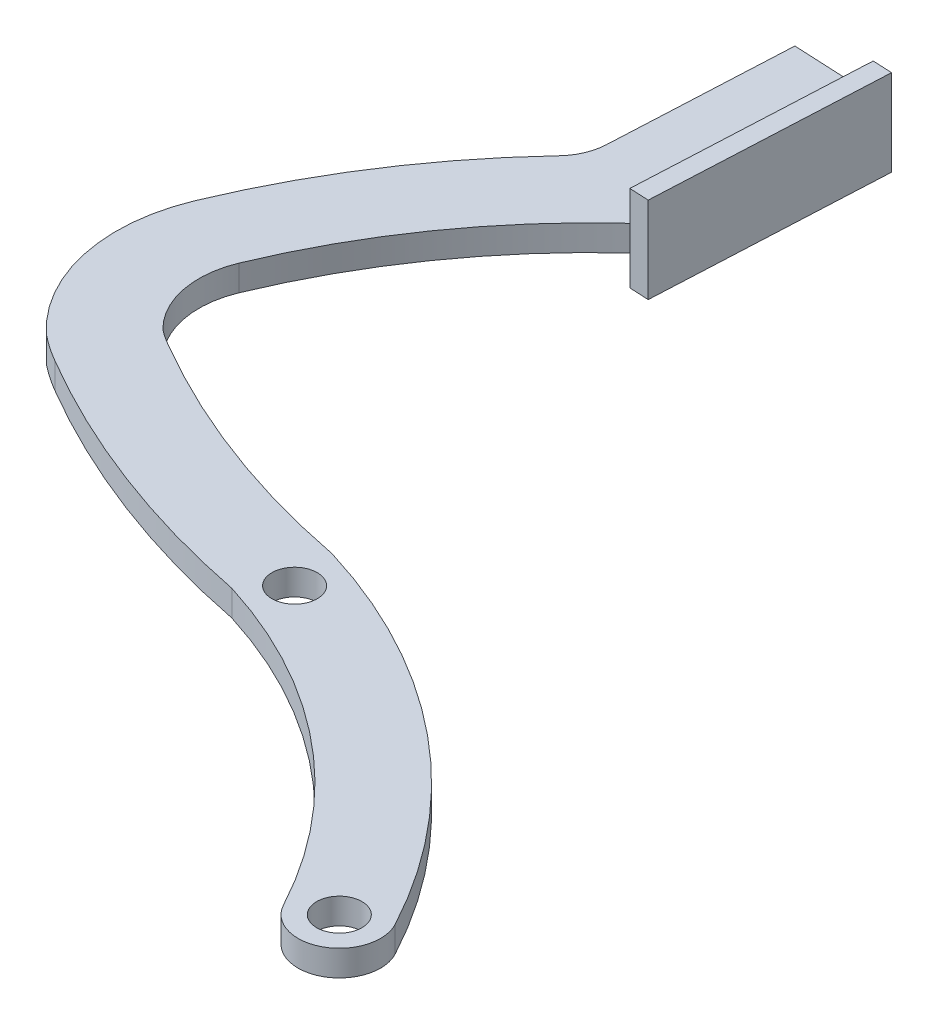
ISO-10303-21;
HEADER;
FILE_DESCRIPTION(('STEP AP214'),'2;1');
FILE_NAME('part.step','',(''),(''),'','','');
FILE_SCHEMA(('AUTOMOTIVE_DESIGN { 1 0 10303 214 1 1 1 1 }'));
ENDSEC;
DATA;
#1=APPLICATION_CONTEXT('core data for automotive mechanical design processes');
#2=APPLICATION_PROTOCOL_DEFINITION('international standard','automotive_design',2000,#1);
#3=PRODUCT_CONTEXT('',#1,'mechanical');
#4=PRODUCT('Part','Part','',(#3));
#5=PRODUCT_RELATED_PRODUCT_CATEGORY('part','',(#4));
#6=PRODUCT_DEFINITION_FORMATION('','',#4);
#7=PRODUCT_DEFINITION_CONTEXT('part definition',#1,'design');
#8=PRODUCT_DEFINITION('design','',#6,#7);
#9=PRODUCT_DEFINITION_SHAPE('','',#8);
#10=(LENGTH_UNIT() NAMED_UNIT(*) SI_UNIT(.MILLI.,.METRE.));
#11=(NAMED_UNIT(*) PLANE_ANGLE_UNIT() SI_UNIT($,.RADIAN.));
#12=(NAMED_UNIT(*) SI_UNIT($,.STERADIAN.) SOLID_ANGLE_UNIT());
#13=UNCERTAINTY_MEASURE_WITH_UNIT(LENGTH_MEASURE(1.E-05),#10,'distance_accuracy_value','');
#14=(GEOMETRIC_REPRESENTATION_CONTEXT(3) GLOBAL_UNCERTAINTY_ASSIGNED_CONTEXT((#13)) GLOBAL_UNIT_ASSIGNED_CONTEXT((#10,
#11,#12)) REPRESENTATION_CONTEXT('',''));
#15=CARTESIAN_POINT('',(0.,0.,0.));
#16=DIRECTION('',(0.,0.,1.));
#17=DIRECTION('',(1.,0.,0.));
#18=AXIS2_PLACEMENT_3D('',#15,#16,#17);
#19=CARTESIAN_POINT('',(-348.669315897256,294.175328837839,-221.974165465518));
#20=DIRECTION('',(0.998808119493648,0.,0.0488092248818146));
#21=DIRECTION('',(0.0488092248818146,0.,-0.998808119493648));
#22=AXIS2_PLACEMENT_3D('',#19,#20,#21);
#23=PLANE('',#22);
#24=DIRECTION('',(0.,1.,0.));
#25=VECTOR('',#24,1.);
#26=CARTESIAN_POINT('',(-345.874902218728,287.825328837839,-279.157681042666));
#27=LINE('',#26,#25);
#28=CARTESIAN_POINT('',(-345.874902218728,315.417604589667,-279.157681042666));
#29=VERTEX_POINT('',#28);
#30=CARTESIAN_POINT('',(-345.874902218728,272.933053086011,-279.157681042666));
#31=VERTEX_POINT('',#30);
#32=EDGE_CURVE('E263',#29,#31,#27,.F.);
#33=ORIENTED_EDGE('',*,*,#32,.F.);
#34=DIRECTION('',(0.0488092248818142,0.,-0.998808119493648));
#35=VECTOR('',#34,1.);
#36=CARTESIAN_POINT('',(-351.463729575784,315.417604589667,-164.790649888372));
#37=LINE('',#36,#35);
#38=CARTESIAN_POINT('',(-351.463729575784,315.417604589667,-164.790649888371));
#39=VERTEX_POINT('',#38);
#40=EDGE_CURVE('E170',#39,#29,#37,.T.);
#41=ORIENTED_EDGE('',*,*,#40,.F.);
#42=DIRECTION('',(0.,1.,0.));
#43=VECTOR('',#42,1.);
#44=CARTESIAN_POINT('',(-351.463729575784,272.933053086011,-164.790649888372));
#45=LINE('',#44,#43);
#46=CARTESIAN_POINT('',(-351.463729575784,272.933053086011,-164.790649888371));
#47=VERTEX_POINT('',#46);
#48=EDGE_CURVE('E164',#47,#39,#45,.T.);
#49=ORIENTED_EDGE('',*,*,#48,.F.);
#50=DIRECTION('',(-0.0488092248818147,0.,0.998808119493648));
#51=VECTOR('',#50,1.);
#52=CARTESIAN_POINT('',(-345.874902218728,272.933053086011,-279.157681042665));
#53=LINE('',#52,#51);
#54=EDGE_CURVE('E151',#31,#47,#53,.T.);
#55=ORIENTED_EDGE('',*,*,#54,.F.);
#56=EDGE_LOOP('',(#33,#41,#49,#55));
#57=FACE_BOUND('',#56,.T.);
#58=ADVANCED_FACE('F15',(#57),#23,.T.);
#59=CARTESIAN_POINT('',(-355.388549556905,272.933053086011,-279.622588909665));
#60=DIRECTION('',(0.,-1.,0.));
#61=DIRECTION('',(1.,0.,0.));
#62=AXIS2_PLACEMENT_3D('',#59,#60,#61);
#63=PLANE('',#62);
#64=DIRECTION('',(0.0488092248818146,0.,-0.998808119493648));
#65=VECTOR('',#64,1.);
#66=CARTESIAN_POINT('',(-358.182963235433,272.933053086011,-222.439073332518));
#67=LINE('',#66,#65);
#68=CARTESIAN_POINT('',(-360.977376913961,272.933053086011,-165.255557755371));
#69=VERTEX_POINT('',#68);
#70=CARTESIAN_POINT('',(-355.388549556905,272.933053086011,-279.622588909665));
#71=VERTEX_POINT('',#70);
#72=EDGE_CURVE('E160',#69,#71,#67,.T.);
#73=ORIENTED_EDGE('',*,*,#72,.T.);
#74=DIRECTION('',(-0.998808119493648,0.,-0.0488092248818143));
#75=VECTOR('',#74,1.);
#76=CARTESIAN_POINT('',(-395.980111533126,272.933053086011,-281.606195808862));
#77=LINE('',#76,#75);
#78=EDGE_CURVE('E156',#31,#71,#77,.T.);
#79=ORIENTED_EDGE('',*,*,#78,.F.);
#80=ORIENTED_EDGE('',*,*,#54,.T.);
#81=DIRECTION('',(0.998808119493648,0.,0.0488092248818149));
#82=VECTOR('',#81,1.);
#83=CARTESIAN_POINT('',(-360.977376913961,272.933053086011,-165.255557755371));
#84=LINE('',#83,#82);
#85=EDGE_CURVE('E155',#69,#47,#84,.T.);
#86=ORIENTED_EDGE('',*,*,#85,.F.);
#87=EDGE_LOOP('',(#73,#79,#80,#86));
#88=FACE_BOUND('',#87,.T.);
#89=ADVANCED_FACE('F154',(#88),#63,.T.);
#90=CARTESIAN_POINT('',(-358.182963235433,294.175328837839,-222.439073332518));
#91=DIRECTION('',(0.998808119493648,0.,0.0488092248818146));
#92=DIRECTION('',(0.0488092248818146,0.,-0.998808119493648));
#93=AXIS2_PLACEMENT_3D('',#90,#91,#92);
#94=PLANE('',#93);
#95=DIRECTION('',(0.,1.,0.));
#96=VECTOR('',#95,1.);
#97=CARTESIAN_POINT('',(-355.388549556905,287.825328837839,-279.622588909665));
#98=LINE('',#97,#96);
#99=CARTESIAN_POINT('',(-355.388549556905,287.825328837839,-279.622588909665));
#100=VERTEX_POINT('',#99);
#101=EDGE_CURVE('E279',#71,#100,#98,.T.);
#102=ORIENTED_EDGE('',*,*,#101,.F.);
#103=ORIENTED_EDGE('',*,*,#72,.F.);
#104=DIRECTION('',(0.,1.,0.));
#105=VECTOR('',#104,1.);
#106=CARTESIAN_POINT('',(-360.97737691396,272.933053086011,-165.255557755371));
#107=LINE('',#106,#105);
#108=CARTESIAN_POINT('',(-360.97737691396,287.825328837839,-165.255557755371));
#109=VERTEX_POINT('',#108);
#110=EDGE_CURVE('E168',#109,#69,#107,.F.);
#111=ORIENTED_EDGE('',*,*,#110,.F.);
#112=DIRECTION('',(-0.0488092248818156,0.,0.998808119493648));
#113=VECTOR('',#112,1.);
#114=CARTESIAN_POINT('',(-355.388549556905,287.825328837839,-279.622588909665));
#115=LINE('',#114,#113);
#116=EDGE_CURVE('E119',#100,#109,#115,.T.);
#117=ORIENTED_EDGE('',*,*,#116,.F.);
#118=EDGE_LOOP('',(#102,#103,#111,#117));
#119=FACE_BOUND('',#118,.T.);
#120=ADVANCED_FACE('F369',(#119),#94,.F.);
#121=CARTESIAN_POINT('',(-360.977376913961,315.417604589667,-165.255557755371));
#122=DIRECTION('',(0.,1.,0.));
#123=DIRECTION('',(0.,0.,1.));
#124=AXIS2_PLACEMENT_3D('',#121,#122,#123);
#125=PLANE('',#124);
#126=DIRECTION('',(0.0488092248818146,0.,-0.998808119493648));
#127=VECTOR('',#126,1.);
#128=CARTESIAN_POINT('',(-358.182963235433,315.417604589667,-222.439073332518));
#129=LINE('',#128,#127);
#130=CARTESIAN_POINT('',(-355.388549556905,315.417604589667,-279.622588909665));
#131=VERTEX_POINT('',#130);
#132=CARTESIAN_POINT('',(-360.977376913961,315.417604589667,-165.255557755371));
#133=VERTEX_POINT('',#132);
#134=EDGE_CURVE('E287',#131,#133,#129,.F.);
#135=ORIENTED_EDGE('',*,*,#134,.T.);
#136=DIRECTION('',(0.998808119493648,0.,0.0488092248818149));
#137=VECTOR('',#136,1.);
#138=CARTESIAN_POINT('',(-360.977376913961,315.417604589667,-165.255557755371));
#139=LINE('',#138,#137);
#140=EDGE_CURVE('E128',#39,#133,#139,.F.);
#141=ORIENTED_EDGE('',*,*,#140,.F.);
#142=ORIENTED_EDGE('',*,*,#40,.T.);
#143=DIRECTION('',(-0.998808119493648,0.,-0.0488092248818143));
#144=VECTOR('',#143,1.);
#145=CARTESIAN_POINT('',(-395.980111533126,315.417604589667,-281.606195808862));
#146=LINE('',#145,#144);
#147=EDGE_CURVE('E259',#131,#29,#146,.F.);
#148=ORIENTED_EDGE('',*,*,#147,.F.);
#149=EDGE_LOOP('',(#135,#141,#142,#148));
#150=FACE_BOUND('',#149,.T.);
#151=ADVANCED_FACE('F318',(#150),#125,.T.);
#152=CARTESIAN_POINT('',(-360.977376913961,272.933053086011,-165.255557755371));
#153=DIRECTION('',(-0.0488092248818149,0.,0.998808119493648));
#154=DIRECTION('',(0.998808119493648,0.,0.0488092248818149));
#155=AXIS2_PLACEMENT_3D('',#152,#153,#154);
#156=PLANE('',#155);
#157=ORIENTED_EDGE('',*,*,#110,.T.);
#158=ORIENTED_EDGE('',*,*,#85,.T.);
#159=ORIENTED_EDGE('',*,*,#48,.T.);
#160=ORIENTED_EDGE('',*,*,#140,.T.);
#161=DIRECTION('',(0.,1.,0.));
#162=VECTOR('',#161,1.);
#163=CARTESIAN_POINT('',(-360.977376913961,294.175328837839,-165.255557755371));
#164=LINE('',#163,#162);
#165=CARTESIAN_POINT('',(-360.977376913961,300.525328837839,-165.255557755371));
#166=VERTEX_POINT('',#165);
#167=EDGE_CURVE('E256',#133,#166,#164,.F.);
#168=ORIENTED_EDGE('',*,*,#167,.T.);
#169=DIRECTION('',(0.,1.,0.));
#170=VECTOR('',#169,1.);
#171=CARTESIAN_POINT('',(-360.97737691396,287.825328837839,-165.255557755371));
#172=LINE('',#171,#170);
#173=EDGE_CURVE('E254',#109,#166,#172,.T.);
#174=ORIENTED_EDGE('',*,*,#173,.F.);
#175=EDGE_LOOP('',(#157,#158,#159,#160,#168,#174));
#176=FACE_BOUND('',#175,.T.);
#177=ADVANCED_FACE('F163',(#176),#156,.T.);
#178=CARTESIAN_POINT('',(-335.244415412718,287.825328837839,-10.2654483831399));
#179=DIRECTION('',(0.,-1.,0.));
#180=DIRECTION('',(0.,0.,-1.));
#181=AXIS2_PLACEMENT_3D('',#178,#179,#180);
#182=PLANE('',#181);
#183=CARTESIAN_POINT('',(-400.54261693552,287.825328837839,-35.5137036553109));
#184=DIRECTION('',(0.,1.,0.));
#185=DIRECTION('',(0.,0.,1.));
#186=AXIS2_PLACEMENT_3D('',#183,#184,#185);
#187=CIRCLE('',#186,83.6800195970675);
#188=CARTESIAN_POINT('',(-477.889176788649,287.825328837839,-67.4488779722265));
#189=VERTEX_POINT('',#188);
#190=CARTESIAN_POINT('',(-457.23799489086,287.825328837839,26.0328624411554));
#191=VERTEX_POINT('',#190);
#192=EDGE_CURVE('E229',#189,#191,#187,.T.);
#193=ORIENTED_EDGE('',*,*,#192,.F.);
#194=CARTESIAN_POINT('',(-144.69049717394,287.825328837839,70.6343875829878));
#195=DIRECTION('',(0.,1.,0.));
#196=DIRECTION('',(0.,0.,1.));
#197=AXIS2_PLACEMENT_3D('',#194,#195,#196);
#198=CIRCLE('',#197,360.677623818525);
#199=CARTESIAN_POINT('',(-407.198761517105,287.825328837839,-176.706994872348));
#200=VERTEX_POINT('',#199);
#201=EDGE_CURVE('E226',#200,#189,#198,.T.);
#202=ORIENTED_EDGE('',*,*,#201,.F.);
#203=CARTESIAN_POINT('',(-425.685380797017,287.825328837839,-194.12551684178));
#204=DIRECTION('',(0.,1.,0.));
#205=DIRECTION('',(0.,0.,1.));
#206=AXIS2_PLACEMENT_3D('',#203,#204,#205);
#207=CIRCLE('',#206,25.4);
#208=CARTESIAN_POINT('',(-400.315654561878,287.825328837839,-192.885762529782));
#209=VERTEX_POINT('',#208);
#210=EDGE_CURVE('E222',#209,#200,#207,.F.);
#211=ORIENTED_EDGE('',*,*,#210,.F.);
#212=DIRECTION('',(-0.0488092248818167,0.,0.998808119493647));
#213=VECTOR('',#212,1.);
#214=CARTESIAN_POINT('',(-400.315654561878,287.825328837839,-192.885762529782));
#215=LINE('',#214,#213);
#216=CARTESIAN_POINT('',(-395.980111533127,287.825328837839,-281.606195808862));
#217=VERTEX_POINT('',#216);
#218=EDGE_CURVE('E332',#217,#209,#215,.T.);
#219=ORIENTED_EDGE('',*,*,#218,.F.);
#220=DIRECTION('',(-0.998808119493648,0.,-0.0488092248818143));
#221=VECTOR('',#220,1.);
#222=CARTESIAN_POINT('',(-395.980111533126,287.825328837839,-281.606195808862));
#223=LINE('',#222,#221);
#224=EDGE_CURVE('E275',#100,#217,#223,.T.);
#225=ORIENTED_EDGE('',*,*,#224,.F.);
#226=ORIENTED_EDGE('',*,*,#116,.T.);
#227=CARTESIAN_POINT('',(-144.690497173941,287.825328837839,70.6343875829879));
#228=DIRECTION('',(0.,1.,0.));
#229=DIRECTION('',(0.,0.,1.));
#230=AXIS2_PLACEMENT_3D('',#227,#228,#229);
#231=CIRCLE('',#230,320.037623818525);
#232=CARTESIAN_POINT('',(-440.333851941672,287.825328837839,-51.9179989343257));
#233=VERTEX_POINT('',#232);
#234=EDGE_CURVE('E255',#233,#109,#231,.F.);
#235=ORIENTED_EDGE('',*,*,#234,.F.);
#236=CARTESIAN_POINT('',(-400.54261693552,287.825328837839,-35.5137036553116));
#237=DIRECTION('',(0.,1.,0.));
#238=DIRECTION('',(0.,0.,1.));
#239=AXIS2_PLACEMENT_3D('',#236,#237,#238);
#240=CIRCLE('',#239,43.0400195970673);
#241=CARTESIAN_POINT('',(-430.664018920561,287.825328837839,-4.77050230328065));
#242=VERTEX_POINT('',#241);
#243=EDGE_CURVE('E112',#242,#233,#240,.F.);
#244=ORIENTED_EDGE('',*,*,#243,.F.);
#245=CARTESIAN_POINT('',(-390.721379017224,287.825328837839,-56.8783193729468));
#246=DIRECTION('',(0.,1.,0.));
#247=DIRECTION('',(0.,0.,1.));
#248=AXIS2_PLACEMENT_3D('',#245,#246,#247);
#249=CIRCLE('',#248,65.6554573680921);
#250=CARTESIAN_POINT('',(-423.516132675737,287.825328837839,-8.60422844084496E-13));
#251=VERTEX_POINT('',#250);
#252=EDGE_CURVE('E250',#251,#242,#249,.F.);
#253=ORIENTED_EDGE('',*,*,#252,.F.);
#254=CARTESIAN_POINT('',(-216.615601114695,287.825328837839,-351.062777509331));
#255=DIRECTION('',(0.,1.,0.));
#256=DIRECTION('',(0.,0.,1.));
#257=AXIS2_PLACEMENT_3D('',#254,#255,#256);
#258=CIRCLE('',#257,407.495894105459);
#259=CARTESIAN_POINT('',(-293.431701636327,287.825328837839,49.1274152908644));
#260=VERTEX_POINT('',#259);
#261=EDGE_CURVE('E247',#260,#251,#258,.F.);
#262=ORIENTED_EDGE('',*,*,#261,.F.);
#263=CARTESIAN_POINT('',(-378.312937716543,287.825328837839,329.807520741657));
#264=DIRECTION('',(0.,1.,0.));
#265=DIRECTION('',(0.,0.,1.));
#266=AXIS2_PLACEMENT_3D('',#263,#264,#265);
#267=CIRCLE('',#266,293.233943864576);
#268=CARTESIAN_POINT('',(-119.548412350622,287.825328837839,191.868888565885));
#269=VERTEX_POINT('',#268);
#270=EDGE_CURVE('E244',#269,#260,#267,.T.);
#271=ORIENTED_EDGE('',*,*,#270,.F.);
#272=CARTESIAN_POINT('',(-137.479812399805,287.825328837839,201.427512539876));
#273=DIRECTION('',(0.,1.,0.));
#274=DIRECTION('',(0.,0.,1.));
#275=AXIS2_PLACEMENT_3D('',#272,#273,#274);
#276=CIRCLE('',#275,20.3199999999999);
#277=CARTESIAN_POINT('',(-155.411212448988,287.825328837839,210.986136513866));
#278=VERTEX_POINT('',#277);
#279=EDGE_CURVE('E241',#278,#269,#276,.T.);
#280=ORIENTED_EDGE('',*,*,#279,.F.);
#281=CARTESIAN_POINT('',(-378.312937716543,287.825328837839,329.807520741657));
#282=DIRECTION('',(0.,1.,0.));
#283=DIRECTION('',(0.,0.,1.));
#284=AXIS2_PLACEMENT_3D('',#281,#282,#283);
#285=CIRCLE('',#284,252.593943864576);
#286=CARTESIAN_POINT('',(-303.296172203833,287.825328837839,88.6101215660609));
#287=VERTEX_POINT('',#286);
#288=EDGE_CURVE('E238',#287,#278,#285,.F.);
#289=ORIENTED_EDGE('',*,*,#288,.F.);
#290=CARTESIAN_POINT('',(-216.615601114695,287.825328837839,-351.062777509331));
#291=DIRECTION('',(0.,1.,0.));
#292=DIRECTION('',(0.,0.,1.));
#293=AXIS2_PLACEMENT_3D('',#290,#291,#292);
#294=CIRCLE('',#293,448.135894105459);
#295=CARTESIAN_POINT('',(-443.999671650406,287.825328837839,35.1007423269031));
#296=VERTEX_POINT('',#295);
#297=EDGE_CURVE('E235',#296,#287,#294,.T.);
#298=ORIENTED_EDGE('',*,*,#297,.F.);
#299=CARTESIAN_POINT('',(-390.721379017229,287.825328837839,-56.8783193729493));
#300=DIRECTION('',(0.,1.,0.));
#301=DIRECTION('',(0.,0.,1.));
#302=AXIS2_PLACEMENT_3D('',#299,#300,#301);
#303=CIRCLE('',#302,106.295457368091);
#304=EDGE_CURVE('E232',#191,#296,#303,.T.);
#305=ORIENTED_EDGE('',*,*,#304,.F.);
#306=EDGE_LOOP('',(#193,#202,#211,#219,#225,#226,#235,#244,#253,#262,#271,#280,#289,#298,#305));
#307=FACE_BOUND('',#306,.T.);
#308=CARTESIAN_POINT('',(-137.479812399805,287.825328837839,201.427512539876));
#309=DIRECTION('',(0.,1.,0.));
#310=DIRECTION('',(0.,0.,1.));
#311=AXIS2_PLACEMENT_3D('',#308,#309,#310);
#312=CIRCLE('',#311,11.1648454695803);
#313=CARTESIAN_POINT('',(-137.479812399805,287.825328837839,212.592358009456));
#314=VERTEX_POINT('',#313);
#315=EDGE_CURVE('E257',#314,#314,#312,.F.);
#316=ORIENTED_EDGE('',*,*,#315,.F.);
#317=EDGE_LOOP('',(#316));
#318=FACE_BOUND('',#317,.T.);
#319=CARTESIAN_POINT('',(-288.915861619153,287.825328837839,72.0475422581815));
#320=DIRECTION('',(0.,1.,0.));
#321=DIRECTION('',(0.,0.,1.));
#322=AXIS2_PLACEMENT_3D('',#319,#320,#321);
#323=CIRCLE('',#322,11.1648454695803);
#324=CARTESIAN_POINT('',(-288.915861619153,287.825328837839,83.2123877277618));
#325=VERTEX_POINT('',#324);
#326=EDGE_CURVE('E18',#325,#325,#323,.F.);
#327=ORIENTED_EDGE('',*,*,#326,.F.);
#328=EDGE_LOOP('',(#327));
#329=FACE_BOUND('',#328,.T.);
#330=ADVANCED_FACE('F372',(#307,#318,#329),#182,.T.);
#331=CARTESIAN_POINT('',(-288.915861619153,287.825328837839,72.0475422581815));
#332=DIRECTION('',(0.,1.,0.));
#333=DIRECTION('',(0.,0.,1.));
#334=AXIS2_PLACEMENT_3D('',#331,#332,#333);
#335=CYLINDRICAL_SURFACE('',#334,11.1648454695803);
#336=CARTESIAN_POINT('',(-288.915861619153,300.525328837839,72.0475422581815));
#337=DIRECTION('',(0.,1.,0.));
#338=DIRECTION('',(0.,0.,1.));
#339=AXIS2_PLACEMENT_3D('',#336,#337,#338);
#340=CIRCLE('',#339,11.1648454695803);
#341=CARTESIAN_POINT('',(-288.915861619153,300.525328837839,83.2123877277618));
#342=VERTEX_POINT('',#341);
#343=EDGE_CURVE('E219',#342,#342,#340,.T.);
#344=ORIENTED_EDGE('',*,*,#343,.T.);
#345=EDGE_LOOP('',(#344));
#346=FACE_BOUND('',#345,.T.);
#347=ORIENTED_EDGE('',*,*,#326,.T.);
#348=EDGE_LOOP('',(#347));
#349=FACE_BOUND('',#348,.T.);
#350=ADVANCED_FACE('F528',(#346,#349),#335,.F.);
#351=CARTESIAN_POINT('',(-137.479812399805,287.825328837839,201.427512539876));
#352=DIRECTION('',(0.,1.,0.));
#353=DIRECTION('',(0.,0.,1.));
#354=AXIS2_PLACEMENT_3D('',#351,#352,#353);
#355=CYLINDRICAL_SURFACE('',#354,11.1648454695803);
#356=CARTESIAN_POINT('',(-137.479812399805,300.525328837839,201.427512539876));
#357=DIRECTION('',(0.,1.,0.));
#358=DIRECTION('',(0.,0.,1.));
#359=AXIS2_PLACEMENT_3D('',#356,#357,#358);
#360=CIRCLE('',#359,11.1648454695803);
#361=CARTESIAN_POINT('',(-137.479812399805,300.525328837839,212.592358009456));
#362=VERTEX_POINT('',#361);
#363=EDGE_CURVE('E215',#362,#362,#360,.T.);
#364=ORIENTED_EDGE('',*,*,#363,.T.);
#365=EDGE_LOOP('',(#364));
#366=FACE_BOUND('',#365,.T.);
#367=ORIENTED_EDGE('',*,*,#315,.T.);
#368=EDGE_LOOP('',(#367));
#369=FACE_BOUND('',#368,.T.);
#370=ADVANCED_FACE('F521',(#366,#369),#355,.F.);
#371=CARTESIAN_POINT('',(-395.980111533126,287.825328837839,-281.606195808862));
#372=DIRECTION('',(0.0488092248818143,0.,-0.998808119493648));
#373=DIRECTION('',(-0.998808119493648,0.,-0.0488092248818143));
#374=AXIS2_PLACEMENT_3D('',#371,#372,#373);
#375=PLANE('',#374);
#376=ORIENTED_EDGE('',*,*,#224,.T.);
#377=DIRECTION('',(0.,1.,0.));
#378=VECTOR('',#377,1.);
#379=CARTESIAN_POINT('',(-395.980111533127,287.825328837839,-281.606195808862));
#380=LINE('',#379,#378);
#381=CARTESIAN_POINT('',(-395.980111533127,300.525328837839,-281.606195808862));
#382=VERTEX_POINT('',#381);
#383=EDGE_CURVE('E333',#382,#217,#380,.F.);
#384=ORIENTED_EDGE('',*,*,#383,.F.);
#385=DIRECTION('',(0.998808119493648,0.,0.0488092248818138));
#386=VECTOR('',#385,1.);
#387=CARTESIAN_POINT('',(-395.980111533126,300.525328837839,-281.606195808862));
#388=LINE('',#387,#386);
#389=CARTESIAN_POINT('',(-355.388549556905,300.525328837839,-279.622588909665));
#390=VERTEX_POINT('',#389);
#391=EDGE_CURVE('E218',#382,#390,#388,.T.);
#392=ORIENTED_EDGE('',*,*,#391,.T.);
#393=DIRECTION('',(0.,1.,0.));
#394=VECTOR('',#393,1.);
#395=CARTESIAN_POINT('',(-355.388549556905,294.175328837839,-279.622588909665));
#396=LINE('',#395,#394);
#397=EDGE_CURVE('E278',#390,#131,#396,.T.);
#398=ORIENTED_EDGE('',*,*,#397,.T.);
#399=ORIENTED_EDGE('',*,*,#147,.T.);
#400=ORIENTED_EDGE('',*,*,#32,.T.);
#401=ORIENTED_EDGE('',*,*,#78,.T.);
#402=ORIENTED_EDGE('',*,*,#101,.T.);
#403=EDGE_LOOP('',(#376,#384,#392,#398,#399,#400,#401,#402));
#404=FACE_BOUND('',#403,.T.);
#405=ADVANCED_FACE('F312',(#404),#375,.T.);
#406=CARTESIAN_POINT('',(-358.182963235433,294.175328837839,-222.439073332518));
#407=DIRECTION('',(0.998808119493648,0.,0.0488092248818146));
#408=DIRECTION('',(0.0488092248818146,0.,-0.998808119493648));
#409=AXIS2_PLACEMENT_3D('',#406,#407,#408);
#410=PLANE('',#409);
#411=ORIENTED_EDGE('',*,*,#167,.F.);
#412=ORIENTED_EDGE('',*,*,#134,.F.);
#413=ORIENTED_EDGE('',*,*,#397,.F.);
#414=DIRECTION('',(-0.0488092248818156,0.,0.998808119493648));
#415=VECTOR('',#414,1.);
#416=CARTESIAN_POINT('',(-355.388549556905,300.525328837839,-279.622588909665));
#417=LINE('',#416,#415);
#418=EDGE_CURVE('E214',#390,#166,#417,.T.);
#419=ORIENTED_EDGE('',*,*,#418,.T.);
#420=EDGE_LOOP('',(#411,#412,#413,#419));
#421=FACE_BOUND('',#420,.T.);
#422=ADVANCED_FACE('F320',(#421),#410,.F.);
#423=CARTESIAN_POINT('',(-144.690497173941,287.825328837839,70.6343875829879));
#424=DIRECTION('',(0.,1.,0.));
#425=DIRECTION('',(0.,0.,1.));
#426=AXIS2_PLACEMENT_3D('',#423,#424,#425);
#427=CYLINDRICAL_SURFACE('',#426,320.037623818525);
#428=ORIENTED_EDGE('',*,*,#234,.T.);
#429=ORIENTED_EDGE('',*,*,#173,.T.);
#430=CARTESIAN_POINT('',(-144.690497173941,300.525328837839,70.6343875829879));
#431=DIRECTION('',(0.,1.,0.));
#432=DIRECTION('',(0.,0.,1.));
#433=AXIS2_PLACEMENT_3D('',#430,#431,#432);
#434=CIRCLE('',#433,320.037623818525);
#435=CARTESIAN_POINT('',(-440.333851941672,300.525328837839,-51.9179989343257));
#436=VERTEX_POINT('',#435);
#437=EDGE_CURVE('E211',#166,#436,#434,.T.);
#438=ORIENTED_EDGE('',*,*,#437,.T.);
#439=DIRECTION('',(0.,1.,0.));
#440=VECTOR('',#439,1.);
#441=CARTESIAN_POINT('',(-440.333851941672,287.825328837839,-51.9179989343252));
#442=LINE('',#441,#440);
#443=EDGE_CURVE('E252',#233,#436,#442,.T.);
#444=ORIENTED_EDGE('',*,*,#443,.F.);
#445=EDGE_LOOP('',(#428,#429,#438,#444));
#446=FACE_BOUND('',#445,.T.);
#447=ADVANCED_FACE('F366',(#446),#427,.F.);
#448=CARTESIAN_POINT('',(-400.54261693552,287.825328837839,-35.5137036553116));
#449=DIRECTION('',(0.,1.,0.));
#450=DIRECTION('',(0.,0.,1.));
#451=AXIS2_PLACEMENT_3D('',#448,#449,#450);
#452=CYLINDRICAL_SURFACE('',#451,43.0400195970673);
#453=ORIENTED_EDGE('',*,*,#243,.T.);
#454=ORIENTED_EDGE('',*,*,#443,.T.);
#455=CARTESIAN_POINT('',(-400.54261693552,300.525328837839,-35.5137036553116));
#456=DIRECTION('',(0.,1.,0.));
#457=DIRECTION('',(0.,0.,1.));
#458=AXIS2_PLACEMENT_3D('',#455,#456,#457);
#459=CIRCLE('',#458,43.0400195970673);
#460=CARTESIAN_POINT('',(-430.664018920561,300.525328837839,-4.77050230328065));
#461=VERTEX_POINT('',#460);
#462=EDGE_CURVE('E208',#436,#461,#459,.T.);
#463=ORIENTED_EDGE('',*,*,#462,.T.);
#464=DIRECTION('',(0.,1.,0.));
#465=VECTOR('',#464,1.);
#466=CARTESIAN_POINT('',(-430.66401892056,287.825328837839,-4.77050230328063));
#467=LINE('',#466,#465);
#468=EDGE_CURVE('E249',#242,#461,#467,.T.);
#469=ORIENTED_EDGE('',*,*,#468,.F.);
#470=EDGE_LOOP('',(#453,#454,#463,#469));
#471=FACE_BOUND('',#470,.T.);
#472=ADVANCED_FACE('F358',(#471),#452,.F.);
#473=CARTESIAN_POINT('',(-390.721379017224,287.825328837839,-56.8783193729468));
#474=DIRECTION('',(0.,1.,0.));
#475=DIRECTION('',(0.,0.,1.));
#476=AXIS2_PLACEMENT_3D('',#473,#474,#475);
#477=CYLINDRICAL_SURFACE('',#476,65.6554573680921);
#478=ORIENTED_EDGE('',*,*,#252,.T.);
#479=ORIENTED_EDGE('',*,*,#468,.T.);
#480=CARTESIAN_POINT('',(-390.721379017224,300.525328837839,-56.8783193729468));
#481=DIRECTION('',(0.,1.,0.));
#482=DIRECTION('',(0.,0.,1.));
#483=AXIS2_PLACEMENT_3D('',#480,#481,#482);
#484=CIRCLE('',#483,65.6554573680921);
#485=CARTESIAN_POINT('',(-423.516132675737,300.525328837839,-8.60422844084496E-13));
#486=VERTEX_POINT('',#485);
#487=EDGE_CURVE('E205',#461,#486,#484,.T.);
#488=ORIENTED_EDGE('',*,*,#487,.T.);
#489=DIRECTION('',(0.,1.,0.));
#490=VECTOR('',#489,1.);
#491=CARTESIAN_POINT('',(-423.516132675735,287.825328837839,0.));
#492=LINE('',#491,#490);
#493=EDGE_CURVE('E246',#251,#486,#492,.T.);
#494=ORIENTED_EDGE('',*,*,#493,.F.);
#495=EDGE_LOOP('',(#478,#479,#488,#494));
#496=FACE_BOUND('',#495,.T.);
#497=ADVANCED_FACE('F418',(#496),#477,.F.);
#498=CARTESIAN_POINT('',(-216.615601114695,287.825328837839,-351.062777509331));
#499=DIRECTION('',(0.,1.,0.));
#500=DIRECTION('',(0.,0.,1.));
#501=AXIS2_PLACEMENT_3D('',#498,#499,#500);
#502=CYLINDRICAL_SURFACE('',#501,407.495894105459);
#503=ORIENTED_EDGE('',*,*,#261,.T.);
#504=ORIENTED_EDGE('',*,*,#493,.T.);
#505=CARTESIAN_POINT('',(-216.615601114695,300.525328837839,-351.062777509331));
#506=DIRECTION('',(0.,1.,0.));
#507=DIRECTION('',(0.,0.,1.));
#508=AXIS2_PLACEMENT_3D('',#505,#506,#507);
#509=CIRCLE('',#508,407.495894105459);
#510=CARTESIAN_POINT('',(-293.431701636327,300.525328837839,49.1274152908644));
#511=VERTEX_POINT('',#510);
#512=EDGE_CURVE('E202',#486,#511,#509,.T.);
#513=ORIENTED_EDGE('',*,*,#512,.T.);
#514=DIRECTION('',(0.,1.,0.));
#515=VECTOR('',#514,1.);
#516=CARTESIAN_POINT('',(-293.431701636326,287.825328837839,49.1274152908646));
#517=LINE('',#516,#515);
#518=EDGE_CURVE('E243',#260,#511,#517,.T.);
#519=ORIENTED_EDGE('',*,*,#518,.F.);
#520=EDGE_LOOP('',(#503,#504,#513,#519));
#521=FACE_BOUND('',#520,.T.);
#522=ADVANCED_FACE('F414',(#521),#502,.F.);
#523=CARTESIAN_POINT('',(-378.312937716543,287.825328837839,329.807520741657));
#524=DIRECTION('',(0.,1.,0.));
#525=DIRECTION('',(0.,0.,1.));
#526=AXIS2_PLACEMENT_3D('',#523,#524,#525);
#527=CYLINDRICAL_SURFACE('',#526,293.233943864576);
#528=ORIENTED_EDGE('',*,*,#270,.T.);
#529=ORIENTED_EDGE('',*,*,#518,.T.);
#530=CARTESIAN_POINT('',(-378.312937716543,300.525328837839,329.807520741657));
#531=DIRECTION('',(0.,1.,0.));
#532=DIRECTION('',(0.,0.,1.));
#533=AXIS2_PLACEMENT_3D('',#530,#531,#532);
#534=CIRCLE('',#533,293.233943864576);
#535=CARTESIAN_POINT('',(-119.548412350622,300.525328837839,191.868888565885));
#536=VERTEX_POINT('',#535);
#537=EDGE_CURVE('E199',#511,#536,#534,.F.);
#538=ORIENTED_EDGE('',*,*,#537,.T.);
#539=DIRECTION('',(0.,1.,0.));
#540=VECTOR('',#539,1.);
#541=CARTESIAN_POINT('',(-119.548412350621,287.825328837839,191.868888565886));
#542=LINE('',#541,#540);
#543=EDGE_CURVE('E240',#269,#536,#542,.T.);
#544=ORIENTED_EDGE('',*,*,#543,.F.);
#545=EDGE_LOOP('',(#528,#529,#538,#544));
#546=FACE_BOUND('',#545,.T.);
#547=ADVANCED_FACE('F410',(#546),#527,.T.);
#548=CARTESIAN_POINT('',(-137.479812399805,287.825328837839,201.427512539876));
#549=DIRECTION('',(0.,1.,0.));
#550=DIRECTION('',(0.,0.,1.));
#551=AXIS2_PLACEMENT_3D('',#548,#549,#550);
#552=CYLINDRICAL_SURFACE('',#551,20.3199999999999);
#553=ORIENTED_EDGE('',*,*,#279,.T.);
#554=ORIENTED_EDGE('',*,*,#543,.T.);
#555=CARTESIAN_POINT('',(-137.479812399805,300.525328837839,201.427512539876));
#556=DIRECTION('',(0.,1.,0.));
#557=DIRECTION('',(0.,0.,1.));
#558=AXIS2_PLACEMENT_3D('',#555,#556,#557);
#559=CIRCLE('',#558,20.3199999999999);
#560=CARTESIAN_POINT('',(-155.411212448988,300.525328837839,210.986136513866));
#561=VERTEX_POINT('',#560);
#562=EDGE_CURVE('E196',#536,#561,#559,.F.);
#563=ORIENTED_EDGE('',*,*,#562,.T.);
#564=DIRECTION('',(0.,1.,0.));
#565=VECTOR('',#564,1.);
#566=CARTESIAN_POINT('',(-155.411212448988,287.825328837839,210.986136513866));
#567=LINE('',#566,#565);
#568=EDGE_CURVE('E237',#278,#561,#567,.T.);
#569=ORIENTED_EDGE('',*,*,#568,.F.);
#570=EDGE_LOOP('',(#553,#554,#563,#569));
#571=FACE_BOUND('',#570,.T.);
#572=ADVANCED_FACE('F405',(#571),#552,.T.);
#573=CARTESIAN_POINT('',(-378.312937716543,287.825328837839,329.807520741657));
#574=DIRECTION('',(0.,1.,0.));
#575=DIRECTION('',(0.,0.,1.));
#576=AXIS2_PLACEMENT_3D('',#573,#574,#575);
#577=CYLINDRICAL_SURFACE('',#576,252.593943864576);
#578=ORIENTED_EDGE('',*,*,#288,.T.);
#579=ORIENTED_EDGE('',*,*,#568,.T.);
#580=CARTESIAN_POINT('',(-378.312937716543,300.525328837839,329.807520741657));
#581=DIRECTION('',(0.,1.,0.));
#582=DIRECTION('',(0.,0.,1.));
#583=AXIS2_PLACEMENT_3D('',#580,#581,#582);
#584=CIRCLE('',#583,252.593943864576);
#585=CARTESIAN_POINT('',(-303.296172203833,300.525328837839,88.6101215660609));
#586=VERTEX_POINT('',#585);
#587=EDGE_CURVE('E193',#561,#586,#584,.T.);
#588=ORIENTED_EDGE('',*,*,#587,.T.);
#589=DIRECTION('',(0.,1.,0.));
#590=VECTOR('',#589,1.);
#591=CARTESIAN_POINT('',(-303.296172203833,287.825328837839,88.610121566061));
#592=LINE('',#591,#590);
#593=EDGE_CURVE('E234',#287,#586,#592,.T.);
#594=ORIENTED_EDGE('',*,*,#593,.F.);
#595=EDGE_LOOP('',(#578,#579,#588,#594));
#596=FACE_BOUND('',#595,.T.);
#597=ADVANCED_FACE('F401',(#596),#577,.F.);
#598=CARTESIAN_POINT('',(-216.615601114695,287.825328837839,-351.062777509331));
#599=DIRECTION('',(0.,1.,0.));
#600=DIRECTION('',(0.,0.,1.));
#601=AXIS2_PLACEMENT_3D('',#598,#599,#600);
#602=CYLINDRICAL_SURFACE('',#601,448.135894105459);
#603=ORIENTED_EDGE('',*,*,#297,.T.);
#604=ORIENTED_EDGE('',*,*,#593,.T.);
#605=CARTESIAN_POINT('',(-216.615601114695,300.525328837839,-351.062777509331));
#606=DIRECTION('',(0.,1.,0.));
#607=DIRECTION('',(0.,0.,1.));
#608=AXIS2_PLACEMENT_3D('',#605,#606,#607);
#609=CIRCLE('',#608,448.135894105459);
#610=CARTESIAN_POINT('',(-443.999671650406,300.525328837839,35.1007423269031));
#611=VERTEX_POINT('',#610);
#612=EDGE_CURVE('E190',#586,#611,#609,.F.);
#613=ORIENTED_EDGE('',*,*,#612,.T.);
#614=DIRECTION('',(0.,1.,0.));
#615=VECTOR('',#614,1.);
#616=CARTESIAN_POINT('',(-443.999671650411,287.825328837839,35.1007423269005));
#617=LINE('',#616,#615);
#618=EDGE_CURVE('E231',#296,#611,#617,.T.);
#619=ORIENTED_EDGE('',*,*,#618,.F.);
#620=EDGE_LOOP('',(#603,#604,#613,#619));
#621=FACE_BOUND('',#620,.T.);
#622=ADVANCED_FACE('F395',(#621),#602,.T.);
#623=CARTESIAN_POINT('',(-390.721379017229,287.825328837839,-56.8783193729493));
#624=DIRECTION('',(0.,1.,0.));
#625=DIRECTION('',(0.,0.,1.));
#626=AXIS2_PLACEMENT_3D('',#623,#624,#625);
#627=CYLINDRICAL_SURFACE('',#626,106.295457368091);
#628=ORIENTED_EDGE('',*,*,#304,.T.);
#629=ORIENTED_EDGE('',*,*,#618,.T.);
#630=CARTESIAN_POINT('',(-390.721379017229,300.525328837839,-56.8783193729493));
#631=DIRECTION('',(0.,1.,0.));
#632=DIRECTION('',(0.,0.,1.));
#633=AXIS2_PLACEMENT_3D('',#630,#631,#632);
#634=CIRCLE('',#633,106.295457368091);
#635=CARTESIAN_POINT('',(-457.23799489086,300.525328837839,26.0328624411554));
#636=VERTEX_POINT('',#635);
#637=EDGE_CURVE('E187',#611,#636,#634,.F.);
#638=ORIENTED_EDGE('',*,*,#637,.T.);
#639=DIRECTION('',(0.,1.,0.));
#640=VECTOR('',#639,1.);
#641=CARTESIAN_POINT('',(-457.23799489086,287.825328837839,26.0328624411554));
#642=LINE('',#641,#640);
#643=EDGE_CURVE('E228',#191,#636,#642,.T.);
#644=ORIENTED_EDGE('',*,*,#643,.F.);
#645=EDGE_LOOP('',(#628,#629,#638,#644));
#646=FACE_BOUND('',#645,.T.);
#647=ADVANCED_FACE('F391',(#646),#627,.T.);
#648=CARTESIAN_POINT('',(-400.54261693552,287.825328837839,-35.5137036553109));
#649=DIRECTION('',(0.,1.,0.));
#650=DIRECTION('',(0.,0.,1.));
#651=AXIS2_PLACEMENT_3D('',#648,#649,#650);
#652=CYLINDRICAL_SURFACE('',#651,83.6800195970675);
#653=ORIENTED_EDGE('',*,*,#192,.T.);
#654=ORIENTED_EDGE('',*,*,#643,.T.);
#655=CARTESIAN_POINT('',(-400.54261693552,300.525328837839,-35.5137036553109));
#656=DIRECTION('',(0.,1.,0.));
#657=DIRECTION('',(0.,0.,1.));
#658=AXIS2_PLACEMENT_3D('',#655,#656,#657);
#659=CIRCLE('',#658,83.6800195970675);
#660=CARTESIAN_POINT('',(-477.889176788649,300.525328837839,-67.4488779722265));
#661=VERTEX_POINT('',#660);
#662=EDGE_CURVE('E184',#636,#661,#659,.F.);
#663=ORIENTED_EDGE('',*,*,#662,.T.);
#664=DIRECTION('',(0.,1.,0.));
#665=VECTOR('',#664,1.);
#666=CARTESIAN_POINT('',(-477.889176788676,287.825328837839,-67.4488779721624));
#667=LINE('',#666,#665);
#668=EDGE_CURVE('E225',#189,#661,#667,.T.);
#669=ORIENTED_EDGE('',*,*,#668,.F.);
#670=EDGE_LOOP('',(#653,#654,#663,#669));
#671=FACE_BOUND('',#670,.T.);
#672=ADVANCED_FACE('F385',(#671),#652,.T.);
#673=CARTESIAN_POINT('',(-144.69049717394,287.825328837839,70.6343875829878));
#674=DIRECTION('',(0.,1.,0.));
#675=DIRECTION('',(0.,0.,1.));
#676=AXIS2_PLACEMENT_3D('',#673,#674,#675);
#677=CYLINDRICAL_SURFACE('',#676,360.677623818525);
#678=ORIENTED_EDGE('',*,*,#201,.T.);
#679=ORIENTED_EDGE('',*,*,#668,.T.);
#680=CARTESIAN_POINT('',(-144.69049717394,300.525328837839,70.6343875829878));
#681=DIRECTION('',(0.,1.,0.));
#682=DIRECTION('',(0.,0.,1.));
#683=AXIS2_PLACEMENT_3D('',#680,#681,#682);
#684=CIRCLE('',#683,360.677623818525);
#685=CARTESIAN_POINT('',(-407.198761517105,300.525328837839,-176.706994872348));
#686=VERTEX_POINT('',#685);
#687=EDGE_CURVE('E181',#661,#686,#684,.F.);
#688=ORIENTED_EDGE('',*,*,#687,.T.);
#689=DIRECTION('',(0.,1.,0.));
#690=VECTOR('',#689,1.);
#691=CARTESIAN_POINT('',(-407.198761517105,287.825328837839,-176.706994872348));
#692=LINE('',#691,#690);
#693=EDGE_CURVE('E224',#200,#686,#692,.T.);
#694=ORIENTED_EDGE('',*,*,#693,.F.);
#695=EDGE_LOOP('',(#678,#679,#688,#694));
#696=FACE_BOUND('',#695,.T.);
#697=ADVANCED_FACE('F382',(#696),#677,.T.);
#698=CARTESIAN_POINT('',(-425.685380797017,287.825328837839,-194.12551684178));
#699=DIRECTION('',(0.,1.,0.));
#700=DIRECTION('',(0.,0.,1.));
#701=AXIS2_PLACEMENT_3D('',#698,#699,#700);
#702=CYLINDRICAL_SURFACE('',#701,25.4);
#703=ORIENTED_EDGE('',*,*,#210,.T.);
#704=ORIENTED_EDGE('',*,*,#693,.T.);
#705=CARTESIAN_POINT('',(-425.685380797017,300.525328837839,-194.12551684178));
#706=DIRECTION('',(0.,1.,0.));
#707=DIRECTION('',(0.,0.,1.));
#708=AXIS2_PLACEMENT_3D('',#705,#706,#707);
#709=CIRCLE('',#708,25.4);
#710=CARTESIAN_POINT('',(-400.315654561878,300.525328837839,-192.885762529782));
#711=VERTEX_POINT('',#710);
#712=EDGE_CURVE('E24',#686,#711,#709,.T.);
#713=ORIENTED_EDGE('',*,*,#712,.T.);
#714=DIRECTION('',(0.,1.,0.));
#715=VECTOR('',#714,1.);
#716=CARTESIAN_POINT('',(-400.315654561878,287.825328837839,-192.885762529782));
#717=LINE('',#716,#715);
#718=EDGE_CURVE('E32',#209,#711,#717,.T.);
#719=ORIENTED_EDGE('',*,*,#718,.F.);
#720=EDGE_LOOP('',(#703,#704,#713,#719));
#721=FACE_BOUND('',#720,.T.);
#722=ADVANCED_FACE('F377',(#721),#702,.F.);
#723=CARTESIAN_POINT('',(-400.315654561878,287.825328837839,-192.885762529782));
#724=DIRECTION('',(-0.998808119493647,0.,-0.0488092248818167));
#725=DIRECTION('',(-0.0488092248818167,0.,0.998808119493647));
#726=AXIS2_PLACEMENT_3D('',#723,#724,#725);
#727=PLANE('',#726);
#728=ORIENTED_EDGE('',*,*,#218,.T.);
#729=ORIENTED_EDGE('',*,*,#718,.T.);
#730=DIRECTION('',(0.0488092248818186,0.,-0.998808119493647));
#731=VECTOR('',#730,1.);
#732=CARTESIAN_POINT('',(-400.315654561878,300.525328837839,-192.885762529782));
#733=LINE('',#732,#731);
#734=EDGE_CURVE('E9',#711,#382,#733,.T.);
#735=ORIENTED_EDGE('',*,*,#734,.T.);
#736=ORIENTED_EDGE('',*,*,#383,.T.);
#737=EDGE_LOOP('',(#728,#729,#735,#736));
#738=FACE_BOUND('',#737,.T.);
#739=ADVANCED_FACE('F429',(#738),#727,.T.);
#740=CARTESIAN_POINT('',(-335.244415412718,300.525328837839,-10.2654483831399));
#741=DIRECTION('',(0.,-1.,0.));
#742=DIRECTION('',(0.,0.,-1.));
#743=AXIS2_PLACEMENT_3D('',#740,#741,#742);
#744=PLANE('',#743);
#745=ORIENTED_EDGE('',*,*,#712,.F.);
#746=ORIENTED_EDGE('',*,*,#687,.F.);
#747=ORIENTED_EDGE('',*,*,#662,.F.);
#748=ORIENTED_EDGE('',*,*,#637,.F.);
#749=ORIENTED_EDGE('',*,*,#612,.F.);
#750=ORIENTED_EDGE('',*,*,#587,.F.);
#751=ORIENTED_EDGE('',*,*,#562,.F.);
#752=ORIENTED_EDGE('',*,*,#537,.F.);
#753=ORIENTED_EDGE('',*,*,#512,.F.);
#754=ORIENTED_EDGE('',*,*,#487,.F.);
#755=ORIENTED_EDGE('',*,*,#462,.F.);
#756=ORIENTED_EDGE('',*,*,#437,.F.);
#757=ORIENTED_EDGE('',*,*,#418,.F.);
#758=ORIENTED_EDGE('',*,*,#391,.F.);
#759=ORIENTED_EDGE('',*,*,#734,.F.);
#760=EDGE_LOOP('',(#745,#746,#747,#748,#749,#750,#751,#752,#753,#754,#755,#756,#757,#758,#759));
#761=FACE_BOUND('',#760,.T.);
#762=ORIENTED_EDGE('',*,*,#363,.F.);
#763=EDGE_LOOP('',(#762));
#764=FACE_BOUND('',#763,.T.);
#765=ORIENTED_EDGE('',*,*,#343,.F.);
#766=EDGE_LOOP('',(#765));
#767=FACE_BOUND('',#766,.T.);
#768=ADVANCED_FACE('F363',(#761,#764,#767),#744,.F.);
#769=CLOSED_SHELL('',(#58,#89,#120,#151,#177,#330,#350,#370,#405,#422,#447,#472,#497,#522,#547,
#572,#597,#622,#647,#672,#697,#722,#739,#768));
#770=MANIFOLD_SOLID_BREP('B1',#769);
#771=ADVANCED_BREP_SHAPE_REPRESENTATION('',(#18,#770),#14);
#772=SHAPE_DEFINITION_REPRESENTATION(#9,#771);
ENDSEC;
END-ISO-10303-21;
